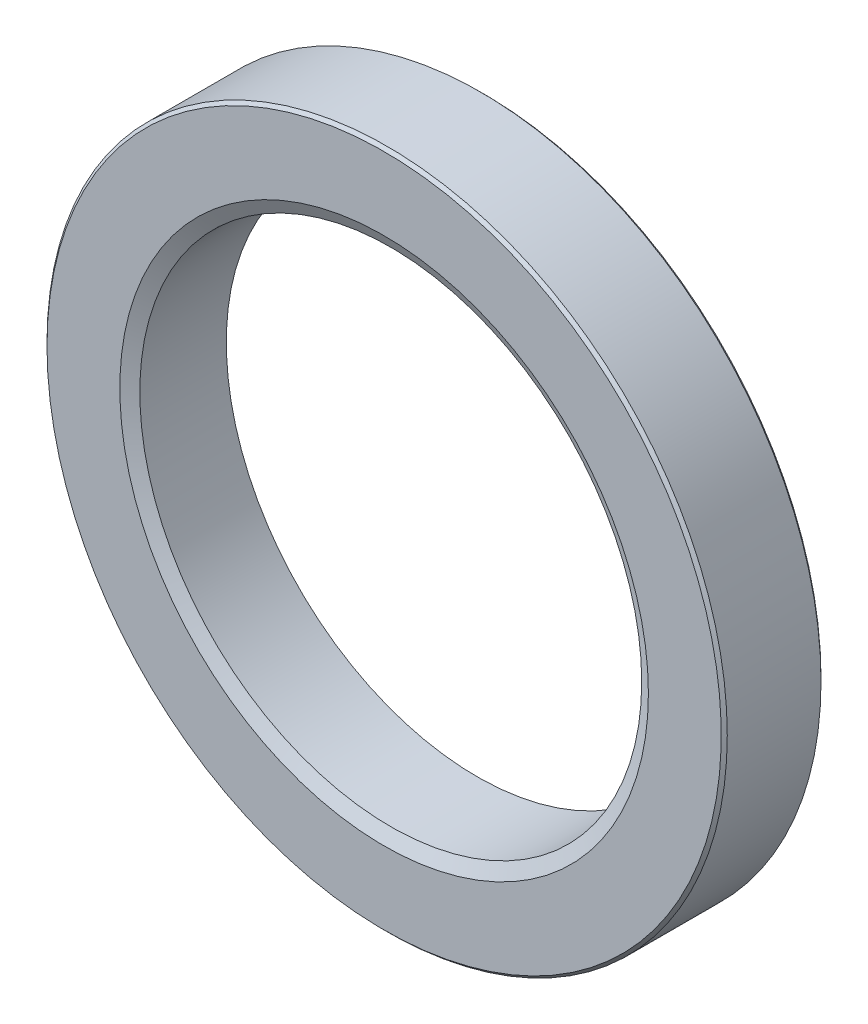
ISO-10303-21;
HEADER;
FILE_DESCRIPTION(('STEP AP214'),'2;1');
FILE_NAME('part.step','',(''),(''),'','','');
FILE_SCHEMA(('AUTOMOTIVE_DESIGN { 1 0 10303 214 1 1 1 1 }'));
ENDSEC;
DATA;
#1=APPLICATION_CONTEXT('core data for automotive mechanical design processes');
#2=APPLICATION_PROTOCOL_DEFINITION('international standard','automotive_design',2000,#1);
#3=PRODUCT_CONTEXT('',#1,'mechanical');
#4=PRODUCT('Part','Part','',(#3));
#5=PRODUCT_RELATED_PRODUCT_CATEGORY('part','',(#4));
#6=PRODUCT_DEFINITION_FORMATION('','',#4);
#7=PRODUCT_DEFINITION_CONTEXT('part definition',#1,'design');
#8=PRODUCT_DEFINITION('design','',#6,#7);
#9=PRODUCT_DEFINITION_SHAPE('','',#8);
#10=(LENGTH_UNIT() NAMED_UNIT(*) SI_UNIT(.MILLI.,.METRE.));
#11=(NAMED_UNIT(*) PLANE_ANGLE_UNIT() SI_UNIT($,.RADIAN.));
#12=(NAMED_UNIT(*) SI_UNIT($,.STERADIAN.) SOLID_ANGLE_UNIT());
#13=UNCERTAINTY_MEASURE_WITH_UNIT(LENGTH_MEASURE(1.E-05),#10,'distance_accuracy_value','');
#14=(GEOMETRIC_REPRESENTATION_CONTEXT(3) GLOBAL_UNCERTAINTY_ASSIGNED_CONTEXT((#13)) GLOBAL_UNIT_ASSIGNED_CONTEXT((#10,
#11,#12)) REPRESENTATION_CONTEXT('',''));
#15=CARTESIAN_POINT('',(0.,0.,0.));
#16=DIRECTION('',(0.,0.,1.));
#17=DIRECTION('',(1.,0.,0.));
#18=AXIS2_PLACEMENT_3D('',#15,#16,#17);
#19=CARTESIAN_POINT('',(0.,0.,16.5));
#20=DIRECTION('',(0.,0.,1.));
#21=DIRECTION('',(1.,0.,0.));
#22=AXIS2_PLACEMENT_3D('',#19,#20,#21);
#23=CONICAL_SURFACE('',#22,87.4125173581698,1.1082840750164);
#24=CARTESIAN_POINT('',(0.,0.,14.3));
#25=DIRECTION('',(0.,0.,1.));
#26=DIRECTION('',(1.,0.,0.));
#27=AXIS2_PLACEMENT_3D('',#24,#25,#26);
#28=CIRCLE('',#27,83.);
#29=CARTESIAN_POINT('',(83.,0.,14.3));
#30=VERTEX_POINT('',#29);
#31=EDGE_CURVE('E69',#30,#30,#28,.T.);
#32=ORIENTED_EDGE('',*,*,#31,.F.);
#33=EDGE_LOOP('',(#32));
#34=FACE_BOUND('',#33,.T.);
#35=CARTESIAN_POINT('',(0.,0.,16.5));
#36=DIRECTION('',(0.,0.,1.));
#37=DIRECTION('',(1.,0.,0.));
#38=AXIS2_PLACEMENT_3D('',#35,#36,#37);
#39=CIRCLE('',#38,87.4125173581698);
#40=CARTESIAN_POINT('',(87.4125173581698,0.,16.5));
#41=VERTEX_POINT('',#40);
#42=EDGE_CURVE('E60',#41,#41,#39,.T.);
#43=ORIENTED_EDGE('',*,*,#42,.T.);
#44=EDGE_LOOP('',(#43));
#45=FACE_BOUND('',#44,.T.);
#46=ADVANCED_FACE('F39',(#34,#45),#23,.F.);
#47=CARTESIAN_POINT('',(0.,87.4125173581698,16.5));
#48=DIRECTION('',(0.,0.,-1.));
#49=DIRECTION('',(-1.,0.,0.));
#50=AXIS2_PLACEMENT_3D('',#47,#48,#49);
#51=PLANE('',#50);
#52=CARTESIAN_POINT('',(0.,0.,16.5));
#53=DIRECTION('',(0.,0.,-1.));
#54=DIRECTION('',(-1.,0.,0.));
#55=AXIS2_PLACEMENT_3D('',#52,#53,#54);
#56=CIRCLE('',#55,111.5);
#57=CARTESIAN_POINT('',(-111.5,0.,16.5));
#58=VERTEX_POINT('',#57);
#59=EDGE_CURVE('E10',#58,#58,#56,.F.);
#60=ORIENTED_EDGE('',*,*,#59,.T.);
#61=EDGE_LOOP('',(#60));
#62=FACE_BOUND('',#61,.T.);
#63=ORIENTED_EDGE('',*,*,#42,.F.);
#64=EDGE_LOOP('',(#63));
#65=FACE_BOUND('',#64,.T.);
#66=ADVANCED_FACE('F77',(#62,#65),#51,.F.);
#67=CARTESIAN_POINT('',(0.,0.,15.0384527485053));
#68=DIRECTION('',(0.,0.,1.));
#69=DIRECTION('',(1.,0.,0.));
#70=AXIS2_PLACEMENT_3D('',#67,#68,#69);
#71=CYLINDRICAL_SURFACE('',#70,112.5);
#72=CARTESIAN_POINT('',(0.,0.,-15.5));
#73=DIRECTION('',(0.,0.,1.));
#74=DIRECTION('',(1.,0.,0.));
#75=AXIS2_PLACEMENT_3D('',#72,#73,#74);
#76=CIRCLE('',#75,112.5);
#77=CARTESIAN_POINT('',(112.5,0.,-15.5));
#78=VERTEX_POINT('',#77);
#79=EDGE_CURVE('E51',#78,#78,#76,.T.);
#80=ORIENTED_EDGE('',*,*,#79,.T.);
#81=EDGE_LOOP('',(#80));
#82=FACE_BOUND('',#81,.T.);
#83=CARTESIAN_POINT('',(0.,0.,15.4999999999999));
#84=DIRECTION('',(0.,0.,-1.));
#85=DIRECTION('',(-1.,0.,0.));
#86=AXIS2_PLACEMENT_3D('',#83,#84,#85);
#87=CIRCLE('',#86,112.5);
#88=CARTESIAN_POINT('',(-112.5,0.,15.4999999999999));
#89=VERTEX_POINT('',#88);
#90=EDGE_CURVE('E55',#89,#89,#87,.T.);
#91=ORIENTED_EDGE('',*,*,#90,.T.);
#92=EDGE_LOOP('',(#91));
#93=FACE_BOUND('',#92,.T.);
#94=ADVANCED_FACE('F82',(#82,#93),#71,.T.);
#95=CARTESIAN_POINT('',(0.,87.4125173581699,-16.5));
#96=DIRECTION('',(0.,0.,1.));
#97=DIRECTION('',(1.,0.,0.));
#98=AXIS2_PLACEMENT_3D('',#95,#96,#97);
#99=PLANE('',#98);
#100=CARTESIAN_POINT('',(0.,0.,-16.5));
#101=DIRECTION('',(0.,0.,1.));
#102=DIRECTION('',(1.,0.,0.));
#103=AXIS2_PLACEMENT_3D('',#100,#101,#102);
#104=CIRCLE('',#103,111.5);
#105=CARTESIAN_POINT('',(111.5,0.,-16.5));
#106=VERTEX_POINT('',#105);
#107=EDGE_CURVE('E47',#106,#106,#104,.F.);
#108=ORIENTED_EDGE('',*,*,#107,.T.);
#109=EDGE_LOOP('',(#108));
#110=FACE_BOUND('',#109,.T.);
#111=CARTESIAN_POINT('',(0.,0.,-16.5));
#112=DIRECTION('',(0.,0.,1.));
#113=DIRECTION('',(1.,0.,0.));
#114=AXIS2_PLACEMENT_3D('',#111,#112,#113);
#115=CIRCLE('',#114,87.4125173581699);
#116=CARTESIAN_POINT('',(87.4125173581699,0.,-16.5));
#117=VERTEX_POINT('',#116);
#118=EDGE_CURVE('E63',#117,#117,#115,.T.);
#119=ORIENTED_EDGE('',*,*,#118,.T.);
#120=EDGE_LOOP('',(#119));
#121=FACE_BOUND('',#120,.T.);
#122=ADVANCED_FACE('F88',(#110,#121),#99,.F.);
#123=CARTESIAN_POINT('',(0.,0.,-14.3));
#124=DIRECTION('',(0.,0.,-1.));
#125=DIRECTION('',(-1.,0.,0.));
#126=AXIS2_PLACEMENT_3D('',#123,#124,#125);
#127=CONICAL_SURFACE('',#126,83.,1.1082840750164);
#128=ORIENTED_EDGE('',*,*,#118,.F.);
#129=EDGE_LOOP('',(#128));
#130=FACE_BOUND('',#129,.T.);
#131=CARTESIAN_POINT('',(0.,0.,-14.3));
#132=DIRECTION('',(0.,0.,1.));
#133=DIRECTION('',(1.,0.,0.));
#134=AXIS2_PLACEMENT_3D('',#131,#132,#133);
#135=CIRCLE('',#134,83.);
#136=CARTESIAN_POINT('',(83.,0.,-14.3));
#137=VERTEX_POINT('',#136);
#138=EDGE_CURVE('E66',#137,#137,#135,.T.);
#139=ORIENTED_EDGE('',*,*,#138,.T.);
#140=EDGE_LOOP('',(#139));
#141=FACE_BOUND('',#140,.T.);
#142=ADVANCED_FACE('F103',(#130,#141),#127,.F.);
#143=CARTESIAN_POINT('',(0.,0.,15.0384527485053));
#144=DIRECTION('',(0.,0.,1.));
#145=DIRECTION('',(1.,0.,0.));
#146=AXIS2_PLACEMENT_3D('',#143,#144,#145);
#147=CYLINDRICAL_SURFACE('',#146,83.);
#148=ORIENTED_EDGE('',*,*,#138,.F.);
#149=EDGE_LOOP('',(#148));
#150=FACE_BOUND('',#149,.T.);
#151=ORIENTED_EDGE('',*,*,#31,.T.);
#152=EDGE_LOOP('',(#151));
#153=FACE_BOUND('',#152,.T.);
#154=ADVANCED_FACE('F73',(#150,#153),#147,.F.);
#155=CARTESIAN_POINT('',(0.,0.,-15.5));
#156=DIRECTION('',(0.,0.,1.));
#157=DIRECTION('',(1.,0.,0.));
#158=AXIS2_PLACEMENT_3D('',#155,#156,#157);
#159=CONICAL_SURFACE('',#158,112.5,0.78539816339745);
#160=ORIENTED_EDGE('',*,*,#107,.F.);
#161=EDGE_LOOP('',(#160));
#162=FACE_BOUND('',#161,.T.);
#163=ORIENTED_EDGE('',*,*,#79,.F.);
#164=EDGE_LOOP('',(#163));
#165=FACE_BOUND('',#164,.T.);
#166=ADVANCED_FACE('F93',(#162,#165),#159,.T.);
#167=CARTESIAN_POINT('',(0.,0.,16.5));
#168=DIRECTION('',(0.,0.,-1.));
#169=DIRECTION('',(-1.,0.,0.));
#170=AXIS2_PLACEMENT_3D('',#167,#168,#169);
#171=CONICAL_SURFACE('',#170,111.5,0.785398163397448);
#172=ORIENTED_EDGE('',*,*,#90,.F.);
#173=EDGE_LOOP('',(#172));
#174=FACE_BOUND('',#173,.T.);
#175=ORIENTED_EDGE('',*,*,#59,.F.);
#176=EDGE_LOOP('',(#175));
#177=FACE_BOUND('',#176,.T.);
#178=ADVANCED_FACE('F42',(#174,#177),#171,.T.);
#179=CLOSED_SHELL('',(#46,#66,#94,#122,#142,#154,#166,#178));
#180=MANIFOLD_SOLID_BREP('B2',#179);
#181=ADVANCED_BREP_SHAPE_REPRESENTATION('',(#18,#180),#14);
#182=SHAPE_DEFINITION_REPRESENTATION(#9,#181);
ENDSEC;
END-ISO-10303-21;
